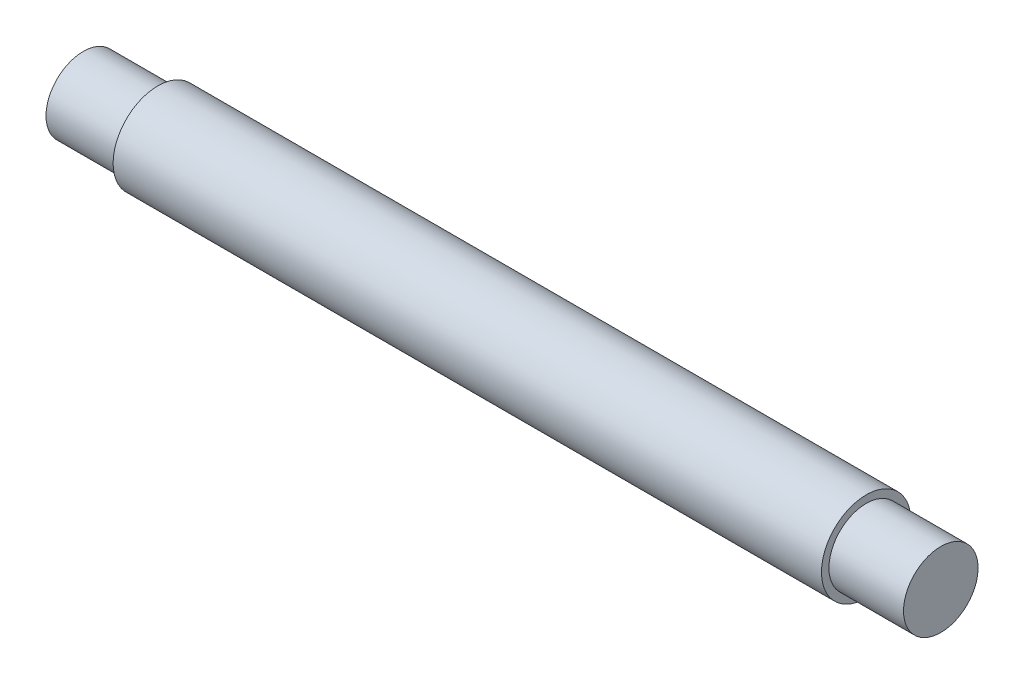
ISO-10303-21;
HEADER;
FILE_DESCRIPTION(('STEP AP214'),'2;1');
FILE_NAME('part.step','',(''),(''),'','','');
FILE_SCHEMA(('AUTOMOTIVE_DESIGN { 1 0 10303 214 1 1 1 1 }'));
ENDSEC;
DATA;
#1=APPLICATION_CONTEXT('core data for automotive mechanical design processes');
#2=APPLICATION_PROTOCOL_DEFINITION('international standard','automotive_design',2000,#1);
#3=PRODUCT_CONTEXT('',#1,'mechanical');
#4=PRODUCT('Part','Part','',(#3));
#5=PRODUCT_RELATED_PRODUCT_CATEGORY('part','',(#4));
#6=PRODUCT_DEFINITION_FORMATION('','',#4);
#7=PRODUCT_DEFINITION_CONTEXT('part definition',#1,'design');
#8=PRODUCT_DEFINITION('design','',#6,#7);
#9=PRODUCT_DEFINITION_SHAPE('','',#8);
#10=(LENGTH_UNIT() NAMED_UNIT(*) SI_UNIT(.MILLI.,.METRE.));
#11=(NAMED_UNIT(*) PLANE_ANGLE_UNIT() SI_UNIT($,.RADIAN.));
#12=(NAMED_UNIT(*) SI_UNIT($,.STERADIAN.) SOLID_ANGLE_UNIT());
#13=UNCERTAINTY_MEASURE_WITH_UNIT(LENGTH_MEASURE(1.E-05),#10,'distance_accuracy_value','');
#14=(GEOMETRIC_REPRESENTATION_CONTEXT(3) GLOBAL_UNCERTAINTY_ASSIGNED_CONTEXT((#13)) GLOBAL_UNIT_ASSIGNED_CONTEXT((#10,
#11,#12)) REPRESENTATION_CONTEXT('',''));
#15=CARTESIAN_POINT('',(0.,0.,0.));
#16=DIRECTION('',(0.,0.,1.));
#17=DIRECTION('',(1.,0.,0.));
#18=AXIS2_PLACEMENT_3D('',#15,#16,#17);
#19=CARTESIAN_POINT('',(115.,0.,0.));
#20=DIRECTION('',(-1.,0.,0.));
#21=DIRECTION('',(0.,0.,1.));
#22=AXIS2_PLACEMENT_3D('',#19,#20,#21);
#23=PLANE('',#22);
#24=CARTESIAN_POINT('',(115.,0.,0.));
#25=DIRECTION('',(-1.,0.,0.));
#26=DIRECTION('',(0.,0.,1.));
#27=AXIS2_PLACEMENT_3D('',#24,#25,#26);
#28=CIRCLE('',#27,5.);
#29=CARTESIAN_POINT('',(115.,0.,5.));
#30=VERTEX_POINT('',#29);
#31=EDGE_CURVE('E10',#30,#30,#28,.T.);
#32=ORIENTED_EDGE('',*,*,#31,.F.);
#33=EDGE_LOOP('',(#32));
#34=FACE_BOUND('',#33,.T.);
#35=ADVANCED_FACE('F39',(#34),#23,.F.);
#36=CARTESIAN_POINT('',(0.,0.,0.));
#37=DIRECTION('',(-1.,0.,0.));
#38=DIRECTION('',(0.,0.,1.));
#39=AXIS2_PLACEMENT_3D('',#36,#37,#38);
#40=CYLINDRICAL_SURFACE('',#39,5.);
#41=CARTESIAN_POINT('',(105.,0.,0.));
#42=DIRECTION('',(-1.,0.,0.));
#43=DIRECTION('',(0.,0.,1.));
#44=AXIS2_PLACEMENT_3D('',#41,#42,#43);
#45=CIRCLE('',#44,5.);
#46=CARTESIAN_POINT('',(105.,0.,5.));
#47=VERTEX_POINT('',#46);
#48=EDGE_CURVE('E45',#47,#47,#45,.T.);
#49=ORIENTED_EDGE('',*,*,#48,.F.);
#50=EDGE_LOOP('',(#49));
#51=FACE_BOUND('',#50,.T.);
#52=ORIENTED_EDGE('',*,*,#31,.T.);
#53=EDGE_LOOP('',(#52));
#54=FACE_BOUND('',#53,.T.);
#55=ADVANCED_FACE('F87',(#51,#54),#40,.T.);
#56=CARTESIAN_POINT('',(105.,0.,-5.));
#57=DIRECTION('',(-1.,0.,0.));
#58=DIRECTION('',(0.,0.,1.));
#59=AXIS2_PLACEMENT_3D('',#56,#57,#58);
#60=PLANE('',#59);
#61=CARTESIAN_POINT('',(105.,0.,0.));
#62=DIRECTION('',(-1.,0.,0.));
#63=DIRECTION('',(0.,0.,1.));
#64=AXIS2_PLACEMENT_3D('',#61,#62,#63);
#65=CIRCLE('',#64,6.);
#66=CARTESIAN_POINT('',(105.,0.,6.));
#67=VERTEX_POINT('',#66);
#68=EDGE_CURVE('E49',#67,#67,#65,.T.);
#69=ORIENTED_EDGE('',*,*,#68,.F.);
#70=EDGE_LOOP('',(#69));
#71=FACE_BOUND('',#70,.T.);
#72=ORIENTED_EDGE('',*,*,#48,.T.);
#73=EDGE_LOOP('',(#72));
#74=FACE_BOUND('',#73,.T.);
#75=ADVANCED_FACE('F82',(#71,#74),#60,.F.);
#76=CARTESIAN_POINT('',(0.,0.,0.));
#77=DIRECTION('',(-1.,0.,0.));
#78=DIRECTION('',(0.,0.,1.));
#79=AXIS2_PLACEMENT_3D('',#76,#77,#78);
#80=CYLINDRICAL_SURFACE('',#79,5.99999999999999);
#81=CARTESIAN_POINT('',(9.99999999999999,0.,0.));
#82=DIRECTION('',(-1.,0.,0.));
#83=DIRECTION('',(0.,0.,1.));
#84=AXIS2_PLACEMENT_3D('',#81,#82,#83);
#85=CIRCLE('',#84,5.99999999999999);
#86=CARTESIAN_POINT('',(9.99999999999999,0.,5.99999999999999));
#87=VERTEX_POINT('',#86);
#88=EDGE_CURVE('E53',#87,#87,#85,.T.);
#89=ORIENTED_EDGE('',*,*,#88,.F.);
#90=EDGE_LOOP('',(#89));
#91=FACE_BOUND('',#90,.T.);
#92=ORIENTED_EDGE('',*,*,#68,.T.);
#93=EDGE_LOOP('',(#92));
#94=FACE_BOUND('',#93,.T.);
#95=ADVANCED_FACE('F76',(#91,#94),#80,.T.);
#96=CARTESIAN_POINT('',(9.99999999999999,0.,-5.99999999999999));
#97=DIRECTION('',(1.,0.,0.));
#98=DIRECTION('',(0.,0.,-1.));
#99=AXIS2_PLACEMENT_3D('',#96,#97,#98);
#100=PLANE('',#99);
#101=CARTESIAN_POINT('',(9.99999999999999,0.,0.));
#102=DIRECTION('',(-1.,0.,0.));
#103=DIRECTION('',(0.,0.,1.));
#104=AXIS2_PLACEMENT_3D('',#101,#102,#103);
#105=CIRCLE('',#104,5.);
#106=CARTESIAN_POINT('',(9.99999999999999,0.,5.));
#107=VERTEX_POINT('',#106);
#108=EDGE_CURVE('E58',#107,#107,#105,.T.);
#109=ORIENTED_EDGE('',*,*,#108,.F.);
#110=EDGE_LOOP('',(#109));
#111=FACE_BOUND('',#110,.T.);
#112=ORIENTED_EDGE('',*,*,#88,.T.);
#113=EDGE_LOOP('',(#112));
#114=FACE_BOUND('',#113,.T.);
#115=ADVANCED_FACE('F70',(#111,#114),#100,.F.);
#116=CARTESIAN_POINT('',(0.,0.,0.));
#117=DIRECTION('',(-1.,0.,0.));
#118=DIRECTION('',(0.,0.,1.));
#119=AXIS2_PLACEMENT_3D('',#116,#117,#118);
#120=CYLINDRICAL_SURFACE('',#119,5.);
#121=CARTESIAN_POINT('',(0.,0.,0.));
#122=DIRECTION('',(-1.,0.,0.));
#123=DIRECTION('',(0.,0.,1.));
#124=AXIS2_PLACEMENT_3D('',#121,#122,#123);
#125=CIRCLE('',#124,5.);
#126=CARTESIAN_POINT('',(0.,0.,5.));
#127=VERTEX_POINT('',#126);
#128=EDGE_CURVE('E61',#127,#127,#125,.T.);
#129=ORIENTED_EDGE('',*,*,#128,.F.);
#130=EDGE_LOOP('',(#129));
#131=FACE_BOUND('',#130,.T.);
#132=ORIENTED_EDGE('',*,*,#108,.T.);
#133=EDGE_LOOP('',(#132));
#134=FACE_BOUND('',#133,.T.);
#135=ADVANCED_FACE('F67',(#131,#134),#120,.T.);
#136=CARTESIAN_POINT('',(0.,0.,-5.));
#137=DIRECTION('',(1.,0.,0.));
#138=DIRECTION('',(0.,0.,-1.));
#139=AXIS2_PLACEMENT_3D('',#136,#137,#138);
#140=PLANE('',#139);
#141=ORIENTED_EDGE('',*,*,#128,.T.);
#142=EDGE_LOOP('',(#141));
#143=FACE_BOUND('',#142,.T.);
#144=ADVANCED_FACE('F65',(#143),#140,.F.);
#145=CLOSED_SHELL('',(#35,#55,#75,#95,#115,#135,#144));
#146=MANIFOLD_SOLID_BREP('B2',#145);
#147=ADVANCED_BREP_SHAPE_REPRESENTATION('',(#18,#146),#14);
#148=SHAPE_DEFINITION_REPRESENTATION(#9,#147);
ENDSEC;
END-ISO-10303-21;
